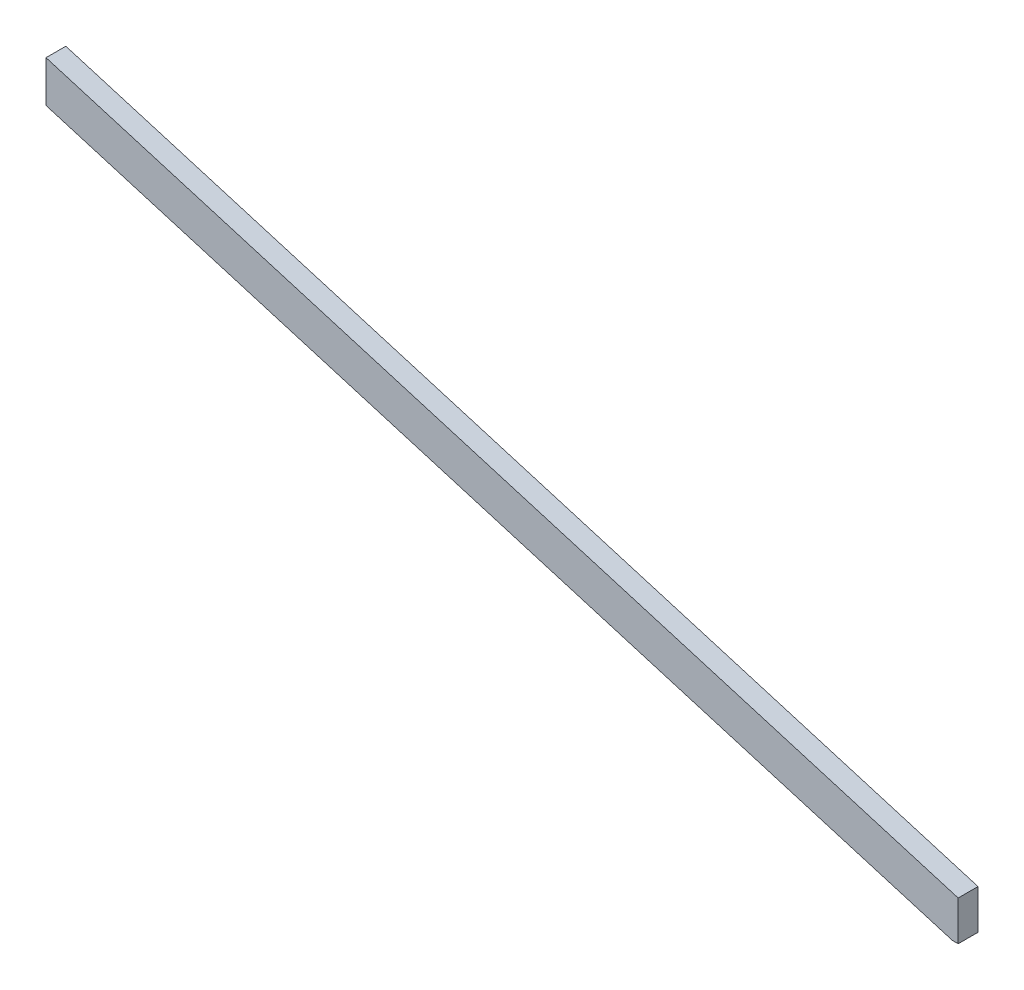
ISO-10303-21;
HEADER;
FILE_DESCRIPTION(('STEP AP214'),'2;1');
FILE_NAME('part.step','',(''),(''),'','','');
FILE_SCHEMA(('AUTOMOTIVE_DESIGN { 1 0 10303 214 1 1 1 1 }'));
ENDSEC;
DATA;
#1=APPLICATION_CONTEXT('core data for automotive mechanical design processes');
#2=APPLICATION_PROTOCOL_DEFINITION('international standard','automotive_design',2000,#1);
#3=PRODUCT_CONTEXT('',#1,'mechanical');
#4=PRODUCT('Part','Part','',(#3));
#5=PRODUCT_RELATED_PRODUCT_CATEGORY('part','',(#4));
#6=PRODUCT_DEFINITION_FORMATION('','',#4);
#7=PRODUCT_DEFINITION_CONTEXT('part definition',#1,'design');
#8=PRODUCT_DEFINITION('design','',#6,#7);
#9=PRODUCT_DEFINITION_SHAPE('','',#8);
#10=(LENGTH_UNIT() NAMED_UNIT(*) SI_UNIT(.MILLI.,.METRE.));
#11=(NAMED_UNIT(*) PLANE_ANGLE_UNIT() SI_UNIT($,.RADIAN.));
#12=(NAMED_UNIT(*) SI_UNIT($,.STERADIAN.) SOLID_ANGLE_UNIT());
#13=UNCERTAINTY_MEASURE_WITH_UNIT(LENGTH_MEASURE(1.E-05),#10,'distance_accuracy_value','');
#14=(GEOMETRIC_REPRESENTATION_CONTEXT(3) GLOBAL_UNCERTAINTY_ASSIGNED_CONTEXT((#13)) GLOBAL_UNIT_ASSIGNED_CONTEXT((#10,
#11,#12)) REPRESENTATION_CONTEXT('',''));
#15=CARTESIAN_POINT('',(0.,0.,0.));
#16=DIRECTION('',(0.,0.,1.));
#17=DIRECTION('',(1.,0.,0.));
#18=AXIS2_PLACEMENT_3D('',#15,#16,#17);
#19=CARTESIAN_POINT('',(-1384.02500000002,398.75,101.6));
#20=DIRECTION('',(-0.285413266519198,-0.958404542609665,0.));
#21=DIRECTION('',(0.958404542609665,-0.285413266519198,0.));
#22=AXIS2_PLACEMENT_3D('',#19,#20,#21);
#23=PLANE('',#22);
#24=DIRECTION('',(-0.958404542609665,0.285413266519198,0.));
#25=VECTOR('',#24,1.);
#26=CARTESIAN_POINT('',(-1384.02500000002,398.75,50.8000000000004));
#27=LINE('',#26,#25);
#28=CARTESIAN_POINT('',(952.775000000001,-297.150000000001,50.8000000000004));
#29=VERTEX_POINT('',#28);
#30=CARTESIAN_POINT('',(-1384.02500000002,398.75,50.8000000000004));
#31=VERTEX_POINT('',#30);
#32=EDGE_CURVE('E107',#29,#31,#27,.T.);
#33=ORIENTED_EDGE('',*,*,#32,.T.);
#34=DIRECTION('',(0.,0.,-1.));
#35=VECTOR('',#34,1.);
#36=CARTESIAN_POINT('',(-1384.02500000002,398.75,101.6));
#37=LINE('',#36,#35);
#38=CARTESIAN_POINT('',(-1384.02500000002,398.75,101.6));
#39=VERTEX_POINT('',#38);
#40=EDGE_CURVE('E11',#39,#31,#37,.T.);
#41=ORIENTED_EDGE('',*,*,#40,.F.);
#42=DIRECTION('',(-0.958404542609665,0.285413266519198,0.));
#43=VECTOR('',#42,1.);
#44=CARTESIAN_POINT('',(-1384.02500000002,398.75,101.6));
#45=LINE('',#44,#43);
#46=CARTESIAN_POINT('',(952.775000000001,-297.150000000001,101.6));
#47=VERTEX_POINT('',#46);
#48=EDGE_CURVE('E115',#47,#39,#45,.T.);
#49=ORIENTED_EDGE('',*,*,#48,.F.);
#50=DIRECTION('',(0.,0.,-1.));
#51=VECTOR('',#50,1.);
#52=CARTESIAN_POINT('',(952.775000000001,-297.150000000001,101.6));
#53=LINE('',#52,#51);
#54=EDGE_CURVE('E103',#47,#29,#53,.T.);
#55=ORIENTED_EDGE('',*,*,#54,.T.);
#56=EDGE_LOOP('',(#33,#41,#49,#55));
#57=FACE_BOUND('',#56,.T.);
#58=ADVANCED_FACE('F33',(#57),#23,.F.);
#59=CARTESIAN_POINT('',(-1384.02500000002,398.75,101.6));
#60=DIRECTION('',(1.,0.,0.));
#61=DIRECTION('',(0.,1.,0.));
#62=AXIS2_PLACEMENT_3D('',#59,#60,#61);
#63=PLANE('',#62);
#64=DIRECTION('',(0.,-1.,0.));
#65=VECTOR('',#64,1.);
#66=CARTESIAN_POINT('',(-1384.02500000002,398.75,50.8000000000004));
#67=LINE('',#66,#65);
#68=CARTESIAN_POINT('',(-1384.02500000001,292.740485767784,50.8000000000004));
#69=VERTEX_POINT('',#68);
#70=EDGE_CURVE('E110',#31,#69,#67,.T.);
#71=ORIENTED_EDGE('',*,*,#70,.T.);
#72=DIRECTION('',(0.,0.,-1.));
#73=VECTOR('',#72,1.);
#74=CARTESIAN_POINT('',(-1384.02500000001,292.740485767784,101.6));
#75=LINE('',#74,#73);
#76=CARTESIAN_POINT('',(-1384.02500000001,292.740485767784,101.6));
#77=VERTEX_POINT('',#76);
#78=EDGE_CURVE('E41',#77,#69,#75,.T.);
#79=ORIENTED_EDGE('',*,*,#78,.F.);
#80=DIRECTION('',(0.,-1.,0.));
#81=VECTOR('',#80,1.);
#82=CARTESIAN_POINT('',(-1384.02500000002,398.75,101.6));
#83=LINE('',#82,#81);
#84=EDGE_CURVE('E83',#39,#77,#83,.T.);
#85=ORIENTED_EDGE('',*,*,#84,.F.);
#86=ORIENTED_EDGE('',*,*,#40,.T.);
#87=EDGE_LOOP('',(#71,#79,#85,#86));
#88=FACE_BOUND('',#87,.T.);
#89=ADVANCED_FACE('F134',(#88),#63,.F.);
#90=CARTESIAN_POINT('',(-1384.02500000001,292.740485767784,101.6));
#91=DIRECTION('',(0.285413266519199,0.958404542609665,0.));
#92=DIRECTION('',(-0.958404542609665,0.285413266519199,0.));
#93=AXIS2_PLACEMENT_3D('',#90,#91,#92);
#94=PLANE('',#93);
#95=DIRECTION('',(0.958404542609665,-0.285413266519199,0.));
#96=VECTOR('',#95,1.);
#97=CARTESIAN_POINT('',(-1384.02500000001,292.740485767784,50.8000000000004));
#98=LINE('',#97,#96);
#99=CARTESIAN_POINT('',(937.968055240918,-398.75,50.8000000000004));
#100=VERTEX_POINT('',#99);
#101=EDGE_CURVE('E98',#69,#100,#98,.T.);
#102=ORIENTED_EDGE('',*,*,#101,.T.);
#103=DIRECTION('',(0.,0.,-1.));
#104=VECTOR('',#103,1.);
#105=CARTESIAN_POINT('',(937.968055240918,-398.75,101.6));
#106=LINE('',#105,#104);
#107=CARTESIAN_POINT('',(937.968055240918,-398.75,101.6));
#108=VERTEX_POINT('',#107);
#109=EDGE_CURVE('E95',#108,#100,#106,.T.);
#110=ORIENTED_EDGE('',*,*,#109,.F.);
#111=DIRECTION('',(0.958404542609665,-0.285413266519199,0.));
#112=VECTOR('',#111,1.);
#113=CARTESIAN_POINT('',(-1384.02500000001,292.740485767784,101.6));
#114=LINE('',#113,#112);
#115=EDGE_CURVE('E87',#77,#108,#114,.T.);
#116=ORIENTED_EDGE('',*,*,#115,.F.);
#117=ORIENTED_EDGE('',*,*,#78,.T.);
#118=EDGE_LOOP('',(#102,#110,#116,#117));
#119=FACE_BOUND('',#118,.T.);
#120=ADVANCED_FACE('F96',(#119),#94,.F.);
#121=CARTESIAN_POINT('',(952.775000000001,-398.750000000001,101.6));
#122=DIRECTION('',(0.,1.,0.));
#123=DIRECTION('',(-1.,0.,0.));
#124=AXIS2_PLACEMENT_3D('',#121,#122,#123);
#125=PLANE('',#124);
#126=DIRECTION('',(1.,0.,0.));
#127=VECTOR('',#126,1.);
#128=CARTESIAN_POINT('',(952.775000000001,-398.750000000001,50.8000000000004));
#129=LINE('',#128,#127);
#130=CARTESIAN_POINT('',(952.775000000001,-398.750000000001,50.8000000000004));
#131=VERTEX_POINT('',#130);
#132=EDGE_CURVE('E69',#100,#131,#129,.T.);
#133=ORIENTED_EDGE('',*,*,#132,.T.);
#134=DIRECTION('',(0.,0.,-1.));
#135=VECTOR('',#134,1.);
#136=CARTESIAN_POINT('',(952.775000000001,-398.750000000001,101.6));
#137=LINE('',#136,#135);
#138=CARTESIAN_POINT('',(952.775000000001,-398.750000000001,101.6));
#139=VERTEX_POINT('',#138);
#140=EDGE_CURVE('E99',#139,#131,#137,.T.);
#141=ORIENTED_EDGE('',*,*,#140,.F.);
#142=DIRECTION('',(1.,0.,0.));
#143=VECTOR('',#142,1.);
#144=CARTESIAN_POINT('',(952.775000000001,-398.750000000001,101.6));
#145=LINE('',#144,#143);
#146=EDGE_CURVE('E91',#108,#139,#145,.T.);
#147=ORIENTED_EDGE('',*,*,#146,.F.);
#148=ORIENTED_EDGE('',*,*,#109,.T.);
#149=EDGE_LOOP('',(#133,#141,#147,#148));
#150=FACE_BOUND('',#149,.T.);
#151=ADVANCED_FACE('F101',(#150),#125,.F.);
#152=CARTESIAN_POINT('',(952.775000000001,-297.150000000001,101.6));
#153=DIRECTION('',(-1.,0.,0.));
#154=DIRECTION('',(0.,0.,1.));
#155=AXIS2_PLACEMENT_3D('',#152,#153,#154);
#156=PLANE('',#155);
#157=DIRECTION('',(0.,1.,0.));
#158=VECTOR('',#157,1.);
#159=CARTESIAN_POINT('',(952.775000000001,-297.150000000001,50.8000000000004));
#160=LINE('',#159,#158);
#161=EDGE_CURVE('E75',#131,#29,#160,.T.);
#162=ORIENTED_EDGE('',*,*,#161,.T.);
#163=ORIENTED_EDGE('',*,*,#54,.F.);
#164=DIRECTION('',(0.,1.,0.));
#165=VECTOR('',#164,1.);
#166=CARTESIAN_POINT('',(952.775000000001,-297.150000000001,101.6));
#167=LINE('',#166,#165);
#168=EDGE_CURVE('E49',#139,#47,#167,.T.);
#169=ORIENTED_EDGE('',*,*,#168,.F.);
#170=ORIENTED_EDGE('',*,*,#140,.T.);
#171=EDGE_LOOP('',(#162,#163,#169,#170));
#172=FACE_BOUND('',#171,.T.);
#173=ADVANCED_FACE('F123',(#172),#156,.F.);
#174=CARTESIAN_POINT('',(0.,0.,101.6));
#175=DIRECTION('',(0.,0.,-1.));
#176=DIRECTION('',(-1.,0.,0.));
#177=AXIS2_PLACEMENT_3D('',#174,#175,#176);
#178=PLANE('',#177);
#179=ORIENTED_EDGE('',*,*,#48,.T.);
#180=ORIENTED_EDGE('',*,*,#84,.T.);
#181=ORIENTED_EDGE('',*,*,#115,.T.);
#182=ORIENTED_EDGE('',*,*,#146,.T.);
#183=ORIENTED_EDGE('',*,*,#168,.T.);
#184=EDGE_LOOP('',(#179,#180,#181,#182,#183));
#185=FACE_BOUND('',#184,.T.);
#186=ADVANCED_FACE('F89',(#185),#178,.F.);
#187=CARTESIAN_POINT('',(0.,0.,50.8000000000003));
#188=DIRECTION('',(0.,0.,-1.));
#189=DIRECTION('',(-1.,0.,0.));
#190=AXIS2_PLACEMENT_3D('',#187,#188,#189);
#191=PLANE('',#190);
#192=ORIENTED_EDGE('',*,*,#32,.F.);
#193=ORIENTED_EDGE('',*,*,#161,.F.);
#194=ORIENTED_EDGE('',*,*,#132,.F.);
#195=ORIENTED_EDGE('',*,*,#101,.F.);
#196=ORIENTED_EDGE('',*,*,#70,.F.);
#197=EDGE_LOOP('',(#192,#193,#194,#195,#196));
#198=FACE_BOUND('',#197,.T.);
#199=ADVANCED_FACE('F119',(#198),#191,.T.);
#200=CLOSED_SHELL('',(#58,#89,#120,#151,#173,#186,#199));
#201=MANIFOLD_SOLID_BREP('B2',#200);
#202=ADVANCED_BREP_SHAPE_REPRESENTATION('',(#18,#201),#14);
#203=SHAPE_DEFINITION_REPRESENTATION(#9,#202);
ENDSEC;
END-ISO-10303-21;
